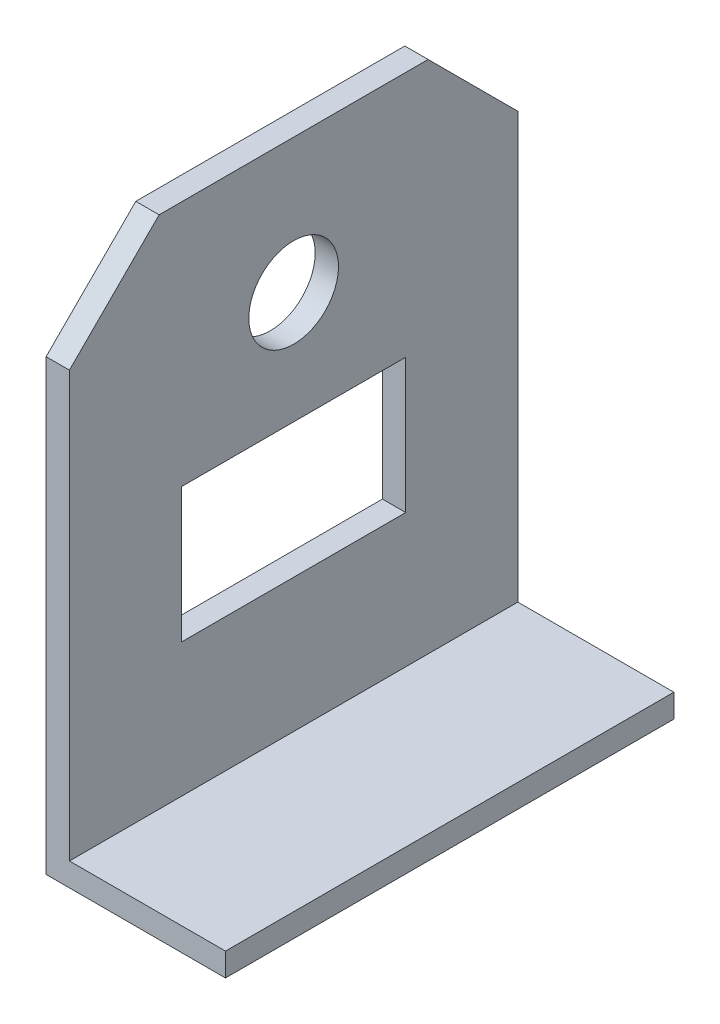
ISO-10303-21;
HEADER;
FILE_DESCRIPTION(('STEP AP214'),'2;1');
FILE_NAME('part.step','',(''),(''),'','','');
FILE_SCHEMA(('AUTOMOTIVE_DESIGN { 1 0 10303 214 1 1 1 1 }'));
ENDSEC;
DATA;
#1=APPLICATION_CONTEXT('core data for automotive mechanical design processes');
#2=APPLICATION_PROTOCOL_DEFINITION('international standard','automotive_design',2000,#1);
#3=PRODUCT_CONTEXT('',#1,'mechanical');
#4=PRODUCT('Part','Part','',(#3));
#5=PRODUCT_RELATED_PRODUCT_CATEGORY('part','',(#4));
#6=PRODUCT_DEFINITION_FORMATION('','',#4);
#7=PRODUCT_DEFINITION_CONTEXT('part definition',#1,'design');
#8=PRODUCT_DEFINITION('design','',#6,#7);
#9=PRODUCT_DEFINITION_SHAPE('','',#8);
#10=(LENGTH_UNIT() NAMED_UNIT(*) SI_UNIT(.MILLI.,.METRE.));
#11=(NAMED_UNIT(*) PLANE_ANGLE_UNIT() SI_UNIT($,.RADIAN.));
#12=(NAMED_UNIT(*) SI_UNIT($,.STERADIAN.) SOLID_ANGLE_UNIT());
#13=UNCERTAINTY_MEASURE_WITH_UNIT(LENGTH_MEASURE(1.E-05),#10,'distance_accuracy_value','');
#14=(GEOMETRIC_REPRESENTATION_CONTEXT(3) GLOBAL_UNCERTAINTY_ASSIGNED_CONTEXT((#13)) GLOBAL_UNIT_ASSIGNED_CONTEXT((#10,
#11,#12)) REPRESENTATION_CONTEXT('',''));
#15=CARTESIAN_POINT('',(0.,0.,0.));
#16=DIRECTION('',(0.,0.,1.));
#17=DIRECTION('',(1.,0.,0.));
#18=AXIS2_PLACEMENT_3D('',#15,#16,#17);
#19=CARTESIAN_POINT('',(25.4,0.,31.75));
#20=DIRECTION('',(0.,1.,0.));
#21=DIRECTION('',(-1.,0.,0.));
#22=AXIS2_PLACEMENT_3D('',#19,#20,#21);
#23=PLANE('',#22);
#24=DIRECTION('',(1.,0.,0.));
#25=VECTOR('',#24,1.);
#26=CARTESIAN_POINT('',(25.4,0.,-31.75));
#27=LINE('',#26,#25);
#28=CARTESIAN_POINT('',(0.,0.,-31.75));
#29=VERTEX_POINT('',#28);
#30=CARTESIAN_POINT('',(25.4,0.,-31.75));
#31=VERTEX_POINT('',#30);
#32=EDGE_CURVE('E175',#29,#31,#27,.T.);
#33=ORIENTED_EDGE('',*,*,#32,.T.);
#34=DIRECTION('',(0.,0.,-1.));
#35=VECTOR('',#34,1.);
#36=CARTESIAN_POINT('',(25.4,0.,31.75));
#37=LINE('',#36,#35);
#38=CARTESIAN_POINT('',(25.4,0.,31.75));
#39=VERTEX_POINT('',#38);
#40=EDGE_CURVE('E11',#39,#31,#37,.T.);
#41=ORIENTED_EDGE('',*,*,#40,.F.);
#42=DIRECTION('',(1.,0.,0.));
#43=VECTOR('',#42,1.);
#44=CARTESIAN_POINT('',(25.4,0.,31.75));
#45=LINE('',#44,#43);
#46=CARTESIAN_POINT('',(0.,0.,31.75));
#47=VERTEX_POINT('',#46);
#48=EDGE_CURVE('E176',#47,#39,#45,.T.);
#49=ORIENTED_EDGE('',*,*,#48,.F.);
#50=DIRECTION('',(0.,0.,-1.));
#51=VECTOR('',#50,1.);
#52=CARTESIAN_POINT('',(0.,0.,31.75));
#53=LINE('',#52,#51);
#54=EDGE_CURVE('E189',#47,#29,#53,.T.);
#55=ORIENTED_EDGE('',*,*,#54,.T.);
#56=EDGE_LOOP('',(#33,#41,#49,#55));
#57=FACE_BOUND('',#56,.T.);
#58=ADVANCED_FACE('F37',(#57),#23,.F.);
#59=CARTESIAN_POINT('',(25.4,3.302,31.75));
#60=DIRECTION('',(-1.,0.,0.));
#61=DIRECTION('',(0.,0.,1.));
#62=AXIS2_PLACEMENT_3D('',#59,#60,#61);
#63=PLANE('',#62);
#64=DIRECTION('',(0.,1.,0.));
#65=VECTOR('',#64,1.);
#66=CARTESIAN_POINT('',(25.4,3.302,-31.75));
#67=LINE('',#66,#65);
#68=CARTESIAN_POINT('',(25.4,3.302,-31.75));
#69=VERTEX_POINT('',#68);
#70=EDGE_CURVE('E192',#31,#69,#67,.T.);
#71=ORIENTED_EDGE('',*,*,#70,.T.);
#72=DIRECTION('',(0.,0.,-1.));
#73=VECTOR('',#72,1.);
#74=CARTESIAN_POINT('',(25.4,3.302,31.75));
#75=LINE('',#74,#73);
#76=CARTESIAN_POINT('',(25.4,3.302,31.75));
#77=VERTEX_POINT('',#76);
#78=EDGE_CURVE('E44',#77,#69,#75,.T.);
#79=ORIENTED_EDGE('',*,*,#78,.F.);
#80=DIRECTION('',(0.,1.,0.));
#81=VECTOR('',#80,1.);
#82=CARTESIAN_POINT('',(25.4,3.302,31.75));
#83=LINE('',#82,#81);
#84=EDGE_CURVE('E179',#39,#77,#83,.T.);
#85=ORIENTED_EDGE('',*,*,#84,.F.);
#86=ORIENTED_EDGE('',*,*,#40,.T.);
#87=EDGE_LOOP('',(#71,#79,#85,#86));
#88=FACE_BOUND('',#87,.T.);
#89=ADVANCED_FACE('F235',(#88),#63,.F.);
#90=CARTESIAN_POINT('',(3.30200000000001,3.302,31.75));
#91=DIRECTION('',(0.,-1.,0.));
#92=DIRECTION('',(1.,0.,0.));
#93=AXIS2_PLACEMENT_3D('',#90,#91,#92);
#94=PLANE('',#93);
#95=DIRECTION('',(-1.,0.,0.));
#96=VECTOR('',#95,1.);
#97=CARTESIAN_POINT('',(3.30200000000001,3.302,-31.75));
#98=LINE('',#97,#96);
#99=CARTESIAN_POINT('',(3.30200000000001,3.302,-31.75));
#100=VERTEX_POINT('',#99);
#101=EDGE_CURVE('E194',#69,#100,#98,.T.);
#102=ORIENTED_EDGE('',*,*,#101,.T.);
#103=DIRECTION('',(0.,0.,-1.));
#104=VECTOR('',#103,1.);
#105=CARTESIAN_POINT('',(3.30200000000001,3.302,31.75));
#106=LINE('',#105,#104);
#107=CARTESIAN_POINT('',(3.30200000000001,3.302,31.75));
#108=VERTEX_POINT('',#107);
#109=EDGE_CURVE('E208',#108,#100,#106,.T.);
#110=ORIENTED_EDGE('',*,*,#109,.F.);
#111=DIRECTION('',(-1.,0.,0.));
#112=VECTOR('',#111,1.);
#113=CARTESIAN_POINT('',(3.30200000000001,3.302,31.75));
#114=LINE('',#113,#112);
#115=EDGE_CURVE('E182',#77,#108,#114,.T.);
#116=ORIENTED_EDGE('',*,*,#115,.F.);
#117=ORIENTED_EDGE('',*,*,#78,.T.);
#118=EDGE_LOOP('',(#102,#110,#116,#117));
#119=FACE_BOUND('',#118,.T.);
#120=ADVANCED_FACE('F215',(#119),#94,.F.);
#121=CARTESIAN_POINT('',(3.302,76.2,31.75));
#122=DIRECTION('',(-1.,0.,0.));
#123=DIRECTION('',(0.,-1.,0.));
#124=AXIS2_PLACEMENT_3D('',#121,#122,#123);
#125=PLANE('',#124);
#126=DIRECTION('',(0.,0.,-1.));
#127=VECTOR('',#126,1.);
#128=CARTESIAN_POINT('',(3.302,22.225,-15.875));
#129=LINE('',#128,#127);
#130=CARTESIAN_POINT('',(3.302,22.225,15.875));
#131=VERTEX_POINT('',#130);
#132=CARTESIAN_POINT('',(3.302,22.225,-15.875));
#133=VERTEX_POINT('',#132);
#134=EDGE_CURVE('E413',#131,#133,#129,.T.);
#135=ORIENTED_EDGE('',*,*,#134,.F.);
#136=DIRECTION('',(0.,-1.,0.));
#137=VECTOR('',#136,1.);
#138=CARTESIAN_POINT('',(3.302,41.275,15.875));
#139=LINE('',#138,#137);
#140=CARTESIAN_POINT('',(3.302,41.275,15.875));
#141=VERTEX_POINT('',#140);
#142=EDGE_CURVE('E51',#141,#131,#139,.T.);
#143=ORIENTED_EDGE('',*,*,#142,.F.);
#144=DIRECTION('',(0.,0.,1.));
#145=VECTOR('',#144,1.);
#146=CARTESIAN_POINT('',(3.302,41.275,-15.875));
#147=LINE('',#146,#145);
#148=CARTESIAN_POINT('',(3.302,41.275,-15.875));
#149=VERTEX_POINT('',#148);
#150=EDGE_CURVE('E140',#149,#141,#147,.T.);
#151=ORIENTED_EDGE('',*,*,#150,.F.);
#152=DIRECTION('',(0.,1.,0.));
#153=VECTOR('',#152,1.);
#154=CARTESIAN_POINT('',(3.302,41.275,-15.875));
#155=LINE('',#154,#153);
#156=EDGE_CURVE('E410',#133,#149,#155,.T.);
#157=ORIENTED_EDGE('',*,*,#156,.F.);
#158=EDGE_LOOP('',(#135,#143,#151,#157));
#159=FACE_BOUND('',#158,.T.);
#160=CARTESIAN_POINT('',(3.302,57.15,0.));
#161=DIRECTION('',(1.,0.,0.));
#162=DIRECTION('',(0.,1.,0.));
#163=AXIS2_PLACEMENT_3D('',#160,#161,#162);
#164=CIRCLE('',#163,6.35);
#165=CARTESIAN_POINT('',(3.302,63.5,0.));
#166=VERTEX_POINT('',#165);
#167=EDGE_CURVE('E169',#166,#166,#164,.T.);
#168=ORIENTED_EDGE('',*,*,#167,.F.);
#169=EDGE_LOOP('',(#168));
#170=FACE_BOUND('',#169,.T.);
#171=DIRECTION('',(0.,0.,-1.));
#172=VECTOR('',#171,1.);
#173=CARTESIAN_POINT('',(3.302,76.2,31.75));
#174=LINE('',#173,#172);
#175=CARTESIAN_POINT('',(3.302,76.2,19.05));
#176=VERTEX_POINT('',#175);
#177=CARTESIAN_POINT('',(3.302,76.2,-19.05));
#178=VERTEX_POINT('',#177);
#179=EDGE_CURVE('E205',#176,#178,#174,.T.);
#180=ORIENTED_EDGE('',*,*,#179,.F.);
#181=DIRECTION('',(0.,0.707106781186548,-0.707106781186547));
#182=VECTOR('',#181,1.);
#183=CARTESIAN_POINT('',(3.302,76.2,19.05));
#184=LINE('',#183,#182);
#185=CARTESIAN_POINT('',(3.302,63.5,31.75));
#186=VERTEX_POINT('',#185);
#187=EDGE_CURVE('E154',#186,#176,#184,.T.);
#188=ORIENTED_EDGE('',*,*,#187,.F.);
#189=DIRECTION('',(0.,1.,0.));
#190=VECTOR('',#189,1.);
#191=CARTESIAN_POINT('',(3.302,76.2,31.75));
#192=LINE('',#191,#190);
#193=EDGE_CURVE('E184',#108,#186,#192,.T.);
#194=ORIENTED_EDGE('',*,*,#193,.F.);
#195=ORIENTED_EDGE('',*,*,#109,.T.);
#196=DIRECTION('',(0.,1.,0.));
#197=VECTOR('',#196,1.);
#198=CARTESIAN_POINT('',(3.302,76.2,-31.75));
#199=LINE('',#198,#197);
#200=CARTESIAN_POINT('',(3.302,63.5,-31.75));
#201=VERTEX_POINT('',#200);
#202=EDGE_CURVE('E196',#100,#201,#199,.T.);
#203=ORIENTED_EDGE('',*,*,#202,.T.);
#204=DIRECTION('',(0.,-0.707106781186548,-0.707106781186547));
#205=VECTOR('',#204,1.);
#206=CARTESIAN_POINT('',(3.302,76.2,-19.05));
#207=LINE('',#206,#205);
#208=EDGE_CURVE('E157',#178,#201,#207,.T.);
#209=ORIENTED_EDGE('',*,*,#208,.F.);
#210=EDGE_LOOP('',(#180,#188,#194,#195,#203,#209));
#211=FACE_BOUND('',#210,.T.);
#212=ADVANCED_FACE('F226',(#159,#170,#211),#125,.F.);
#213=CARTESIAN_POINT('',(0.,76.2,31.75));
#214=DIRECTION('',(0.,-1.,0.));
#215=DIRECTION('',(0.,0.,-1.));
#216=AXIS2_PLACEMENT_3D('',#213,#214,#215);
#217=PLANE('',#216);
#218=DIRECTION('',(0.,0.,-1.));
#219=VECTOR('',#218,1.);
#220=CARTESIAN_POINT('',(0.,76.2,31.75));
#221=LINE('',#220,#219);
#222=CARTESIAN_POINT('',(0.,76.2,19.05));
#223=VERTEX_POINT('',#222);
#224=CARTESIAN_POINT('',(0.,76.2,-19.05));
#225=VERTEX_POINT('',#224);
#226=EDGE_CURVE('E202',#223,#225,#221,.T.);
#227=ORIENTED_EDGE('',*,*,#226,.F.);
#228=DIRECTION('',(1.,0.,0.));
#229=VECTOR('',#228,1.);
#230=CARTESIAN_POINT('',(-37.0265445322677,76.2,19.05));
#231=LINE('',#230,#229);
#232=EDGE_CURVE('E161',#223,#176,#231,.T.);
#233=ORIENTED_EDGE('',*,*,#232,.T.);
#234=ORIENTED_EDGE('',*,*,#179,.T.);
#235=DIRECTION('',(1.,0.,0.));
#236=VECTOR('',#235,1.);
#237=CARTESIAN_POINT('',(-37.0265445322677,76.2,-19.05));
#238=LINE('',#237,#236);
#239=EDGE_CURVE('E155',#225,#178,#238,.T.);
#240=ORIENTED_EDGE('',*,*,#239,.F.);
#241=EDGE_LOOP('',(#227,#233,#234,#240));
#242=FACE_BOUND('',#241,.T.);
#243=ADVANCED_FACE('F246',(#242),#217,.F.);
#244=CARTESIAN_POINT('',(0.,0.,31.75));
#245=DIRECTION('',(1.,0.,0.));
#246=DIRECTION('',(0.,0.,-1.));
#247=AXIS2_PLACEMENT_3D('',#244,#245,#246);
#248=PLANE('',#247);
#249=DIRECTION('',(0.,0.,-1.));
#250=VECTOR('',#249,1.);
#251=CARTESIAN_POINT('',(0.,41.275,-15.875));
#252=LINE('',#251,#250);
#253=CARTESIAN_POINT('',(0.,41.275,15.875));
#254=VERTEX_POINT('',#253);
#255=CARTESIAN_POINT('',(0.,41.275,-15.875));
#256=VERTEX_POINT('',#255);
#257=EDGE_CURVE('E133',#254,#256,#252,.T.);
#258=ORIENTED_EDGE('',*,*,#257,.F.);
#259=DIRECTION('',(0.,1.,0.));
#260=VECTOR('',#259,1.);
#261=CARTESIAN_POINT('',(0.,41.275,15.875));
#262=LINE('',#261,#260);
#263=CARTESIAN_POINT('',(0.,22.225,15.875));
#264=VERTEX_POINT('',#263);
#265=EDGE_CURVE('E124',#264,#254,#262,.T.);
#266=ORIENTED_EDGE('',*,*,#265,.F.);
#267=DIRECTION('',(0.,0.,1.));
#268=VECTOR('',#267,1.);
#269=CARTESIAN_POINT('',(0.,22.225,-15.875));
#270=LINE('',#269,#268);
#271=CARTESIAN_POINT('',(0.,22.225,-15.875));
#272=VERTEX_POINT('',#271);
#273=EDGE_CURVE('E134',#272,#264,#270,.T.);
#274=ORIENTED_EDGE('',*,*,#273,.F.);
#275=DIRECTION('',(0.,-1.,0.));
#276=VECTOR('',#275,1.);
#277=CARTESIAN_POINT('',(0.,41.275,-15.875));
#278=LINE('',#277,#276);
#279=EDGE_CURVE('E142',#256,#272,#278,.T.);
#280=ORIENTED_EDGE('',*,*,#279,.F.);
#281=EDGE_LOOP('',(#258,#266,#274,#280));
#282=FACE_BOUND('',#281,.T.);
#283=CARTESIAN_POINT('',(0.,57.15,0.));
#284=DIRECTION('',(1.,0.,0.));
#285=DIRECTION('',(0.,0.,-1.));
#286=AXIS2_PLACEMENT_3D('',#283,#284,#285);
#287=CIRCLE('',#286,6.35);
#288=CARTESIAN_POINT('',(0.,57.15,-6.35));
#289=VERTEX_POINT('',#288);
#290=EDGE_CURVE('E172',#289,#289,#287,.F.);
#291=ORIENTED_EDGE('',*,*,#290,.F.);
#292=EDGE_LOOP('',(#291));
#293=FACE_BOUND('',#292,.T.);
#294=DIRECTION('',(0.,-1.,0.));
#295=VECTOR('',#294,1.);
#296=CARTESIAN_POINT('',(0.,0.,31.75));
#297=LINE('',#296,#295);
#298=CARTESIAN_POINT('',(0.,63.5,31.75));
#299=VERTEX_POINT('',#298);
#300=EDGE_CURVE('E187',#299,#47,#297,.T.);
#301=ORIENTED_EDGE('',*,*,#300,.F.);
#302=DIRECTION('',(0.,-0.707106781186548,0.707106781186547));
#303=VECTOR('',#302,1.);
#304=CARTESIAN_POINT('',(0.,76.2,19.05));
#305=LINE('',#304,#303);
#306=EDGE_CURVE('E166',#223,#299,#305,.T.);
#307=ORIENTED_EDGE('',*,*,#306,.F.);
#308=ORIENTED_EDGE('',*,*,#226,.T.);
#309=DIRECTION('',(0.,0.707106781186548,0.707106781186547));
#310=VECTOR('',#309,1.);
#311=CARTESIAN_POINT('',(0.,76.2,-19.05));
#312=LINE('',#311,#310);
#313=CARTESIAN_POINT('',(0.,63.5,-31.75));
#314=VERTEX_POINT('',#313);
#315=EDGE_CURVE('E151',#314,#225,#312,.T.);
#316=ORIENTED_EDGE('',*,*,#315,.F.);
#317=DIRECTION('',(0.,-1.,0.));
#318=VECTOR('',#317,1.);
#319=CARTESIAN_POINT('',(0.,0.,-31.75));
#320=LINE('',#319,#318);
#321=EDGE_CURVE('E180',#314,#29,#320,.T.);
#322=ORIENTED_EDGE('',*,*,#321,.T.);
#323=ORIENTED_EDGE('',*,*,#54,.F.);
#324=EDGE_LOOP('',(#301,#307,#308,#316,#322,#323));
#325=FACE_BOUND('',#324,.T.);
#326=ADVANCED_FACE('F145',(#282,#293,#325),#248,.F.);
#327=CARTESIAN_POINT('',(0.,0.,31.75));
#328=DIRECTION('',(0.,0.,-1.));
#329=DIRECTION('',(-1.,0.,0.));
#330=AXIS2_PLACEMENT_3D('',#327,#328,#329);
#331=PLANE('',#330);
#332=ORIENTED_EDGE('',*,*,#193,.T.);
#333=DIRECTION('',(1.,0.,0.));
#334=VECTOR('',#333,1.);
#335=CARTESIAN_POINT('',(-37.0265445322677,63.5,31.75));
#336=LINE('',#335,#334);
#337=EDGE_CURVE('E164',#299,#186,#336,.T.);
#338=ORIENTED_EDGE('',*,*,#337,.F.);
#339=ORIENTED_EDGE('',*,*,#300,.T.);
#340=ORIENTED_EDGE('',*,*,#48,.T.);
#341=ORIENTED_EDGE('',*,*,#84,.T.);
#342=ORIENTED_EDGE('',*,*,#115,.T.);
#343=EDGE_LOOP('',(#332,#338,#339,#340,#341,#342));
#344=FACE_BOUND('',#343,.T.);
#345=ADVANCED_FACE('F231',(#344),#331,.F.);
#346=CARTESIAN_POINT('',(0.,0.,-31.75));
#347=DIRECTION('',(0.,0.,-1.));
#348=DIRECTION('',(-1.,0.,0.));
#349=AXIS2_PLACEMENT_3D('',#346,#347,#348);
#350=PLANE('',#349);
#351=DIRECTION('',(1.,0.,0.));
#352=VECTOR('',#351,1.);
#353=CARTESIAN_POINT('',(-37.0265445322677,63.5,-31.75));
#354=LINE('',#353,#352);
#355=EDGE_CURVE('E153',#314,#201,#354,.T.);
#356=ORIENTED_EDGE('',*,*,#355,.T.);
#357=ORIENTED_EDGE('',*,*,#202,.F.);
#358=ORIENTED_EDGE('',*,*,#101,.F.);
#359=ORIENTED_EDGE('',*,*,#70,.F.);
#360=ORIENTED_EDGE('',*,*,#32,.F.);
#361=ORIENTED_EDGE('',*,*,#321,.F.);
#362=EDGE_LOOP('',(#356,#357,#358,#359,#360,#361));
#363=FACE_BOUND('',#362,.T.);
#364=ADVANCED_FACE('F220',(#363),#350,.T.);
#365=CARTESIAN_POINT('',(-37.0265445322677,76.2,-19.05));
#366=DIRECTION('',(0.,-0.707106781186547,0.707106781186548));
#367=DIRECTION('',(0.,-0.707106781186548,-0.707106781186547));
#368=AXIS2_PLACEMENT_3D('',#365,#366,#367);
#369=PLANE('',#368);
#370=ORIENTED_EDGE('',*,*,#315,.T.);
#371=ORIENTED_EDGE('',*,*,#239,.T.);
#372=ORIENTED_EDGE('',*,*,#208,.T.);
#373=ORIENTED_EDGE('',*,*,#355,.F.);
#374=EDGE_LOOP('',(#370,#371,#372,#373));
#375=FACE_BOUND('',#374,.T.);
#376=ADVANCED_FACE('F244',(#375),#369,.F.);
#377=CARTESIAN_POINT('',(-37.0265445322677,76.2,19.05));
#378=DIRECTION('',(0.,-0.707106781186547,-0.707106781186548));
#379=DIRECTION('',(0.,0.707106781186548,-0.707106781186547));
#380=AXIS2_PLACEMENT_3D('',#377,#378,#379);
#381=PLANE('',#380);
#382=ORIENTED_EDGE('',*,*,#306,.T.);
#383=ORIENTED_EDGE('',*,*,#337,.T.);
#384=ORIENTED_EDGE('',*,*,#187,.T.);
#385=ORIENTED_EDGE('',*,*,#232,.F.);
#386=EDGE_LOOP('',(#382,#383,#384,#385));
#387=FACE_BOUND('',#386,.T.);
#388=ADVANCED_FACE('F248',(#387),#381,.F.);
#389=CARTESIAN_POINT('',(-37.0265445322677,57.15,0.));
#390=DIRECTION('',(1.,0.,0.));
#391=DIRECTION('',(0.,1.,0.));
#392=AXIS2_PLACEMENT_3D('',#389,#390,#391);
#393=CYLINDRICAL_SURFACE('',#392,6.35);
#394=ORIENTED_EDGE('',*,*,#290,.T.);
#395=EDGE_LOOP('',(#394));
#396=FACE_BOUND('',#395,.T.);
#397=ORIENTED_EDGE('',*,*,#167,.T.);
#398=EDGE_LOOP('',(#397));
#399=FACE_BOUND('',#398,.T.);
#400=ADVANCED_FACE('F250',(#396,#399),#393,.F.);
#401=CARTESIAN_POINT('',(-37.0265445322677,41.275,15.875));
#402=DIRECTION('',(0.,0.,1.));
#403=DIRECTION('',(0.,-1.,0.));
#404=AXIS2_PLACEMENT_3D('',#401,#402,#403);
#405=PLANE('',#404);
#406=ORIENTED_EDGE('',*,*,#265,.T.);
#407=DIRECTION('',(1.,0.,0.));
#408=VECTOR('',#407,1.);
#409=CARTESIAN_POINT('',(-37.0265445322677,41.275,15.875));
#410=LINE('',#409,#408);
#411=EDGE_CURVE('E127',#254,#141,#410,.T.);
#412=ORIENTED_EDGE('',*,*,#411,.T.);
#413=ORIENTED_EDGE('',*,*,#142,.T.);
#414=DIRECTION('',(1.,0.,0.));
#415=VECTOR('',#414,1.);
#416=CARTESIAN_POINT('',(-37.0265445322677,22.225,15.875));
#417=LINE('',#416,#415);
#418=EDGE_CURVE('E129',#264,#131,#417,.T.);
#419=ORIENTED_EDGE('',*,*,#418,.F.);
#420=EDGE_LOOP('',(#406,#412,#413,#419));
#421=FACE_BOUND('',#420,.T.);
#422=ADVANCED_FACE('F126',(#421),#405,.F.);
#423=CARTESIAN_POINT('',(-37.0265445322677,41.275,-15.875));
#424=DIRECTION('',(0.,1.,0.));
#425=DIRECTION('',(0.,0.,1.));
#426=AXIS2_PLACEMENT_3D('',#423,#424,#425);
#427=PLANE('',#426);
#428=ORIENTED_EDGE('',*,*,#257,.T.);
#429=DIRECTION('',(1.,0.,0.));
#430=VECTOR('',#429,1.);
#431=CARTESIAN_POINT('',(-37.0265445322677,41.275,-15.875));
#432=LINE('',#431,#430);
#433=EDGE_CURVE('E141',#256,#149,#432,.T.);
#434=ORIENTED_EDGE('',*,*,#433,.T.);
#435=ORIENTED_EDGE('',*,*,#150,.T.);
#436=ORIENTED_EDGE('',*,*,#411,.F.);
#437=EDGE_LOOP('',(#428,#434,#435,#436));
#438=FACE_BOUND('',#437,.T.);
#439=ADVANCED_FACE('F137',(#438),#427,.F.);
#440=CARTESIAN_POINT('',(-37.0265445322677,41.275,-15.875));
#441=DIRECTION('',(0.,0.,-1.));
#442=DIRECTION('',(-1.,0.,0.));
#443=AXIS2_PLACEMENT_3D('',#440,#441,#442);
#444=PLANE('',#443);
#445=ORIENTED_EDGE('',*,*,#279,.T.);
#446=DIRECTION('',(1.,0.,0.));
#447=VECTOR('',#446,1.);
#448=CARTESIAN_POINT('',(-37.0265445322677,22.225,-15.875));
#449=LINE('',#448,#447);
#450=EDGE_CURVE('E59',#272,#133,#449,.T.);
#451=ORIENTED_EDGE('',*,*,#450,.T.);
#452=ORIENTED_EDGE('',*,*,#156,.T.);
#453=ORIENTED_EDGE('',*,*,#433,.F.);
#454=EDGE_LOOP('',(#445,#451,#452,#453));
#455=FACE_BOUND('',#454,.T.);
#456=ADVANCED_FACE('F321',(#455),#444,.F.);
#457=CARTESIAN_POINT('',(-37.0265445322677,22.225,-15.875));
#458=DIRECTION('',(0.,-1.,0.));
#459=DIRECTION('',(0.,0.,-1.));
#460=AXIS2_PLACEMENT_3D('',#457,#458,#459);
#461=PLANE('',#460);
#462=ORIENTED_EDGE('',*,*,#273,.T.);
#463=ORIENTED_EDGE('',*,*,#418,.T.);
#464=ORIENTED_EDGE('',*,*,#134,.T.);
#465=ORIENTED_EDGE('',*,*,#450,.F.);
#466=EDGE_LOOP('',(#462,#463,#464,#465));
#467=FACE_BOUND('',#466,.T.);
#468=ADVANCED_FACE('F331',(#467),#461,.F.);
#469=CLOSED_SHELL('',(#58,#89,#120,#212,#243,#326,#345,#364,#376,#388,#400,#422,#439,#456,#468));
#470=MANIFOLD_SOLID_BREP('B2',#469);
#471=ADVANCED_BREP_SHAPE_REPRESENTATION('',(#18,#470),#14);
#472=SHAPE_DEFINITION_REPRESENTATION(#9,#471);
ENDSEC;
END-ISO-10303-21;
